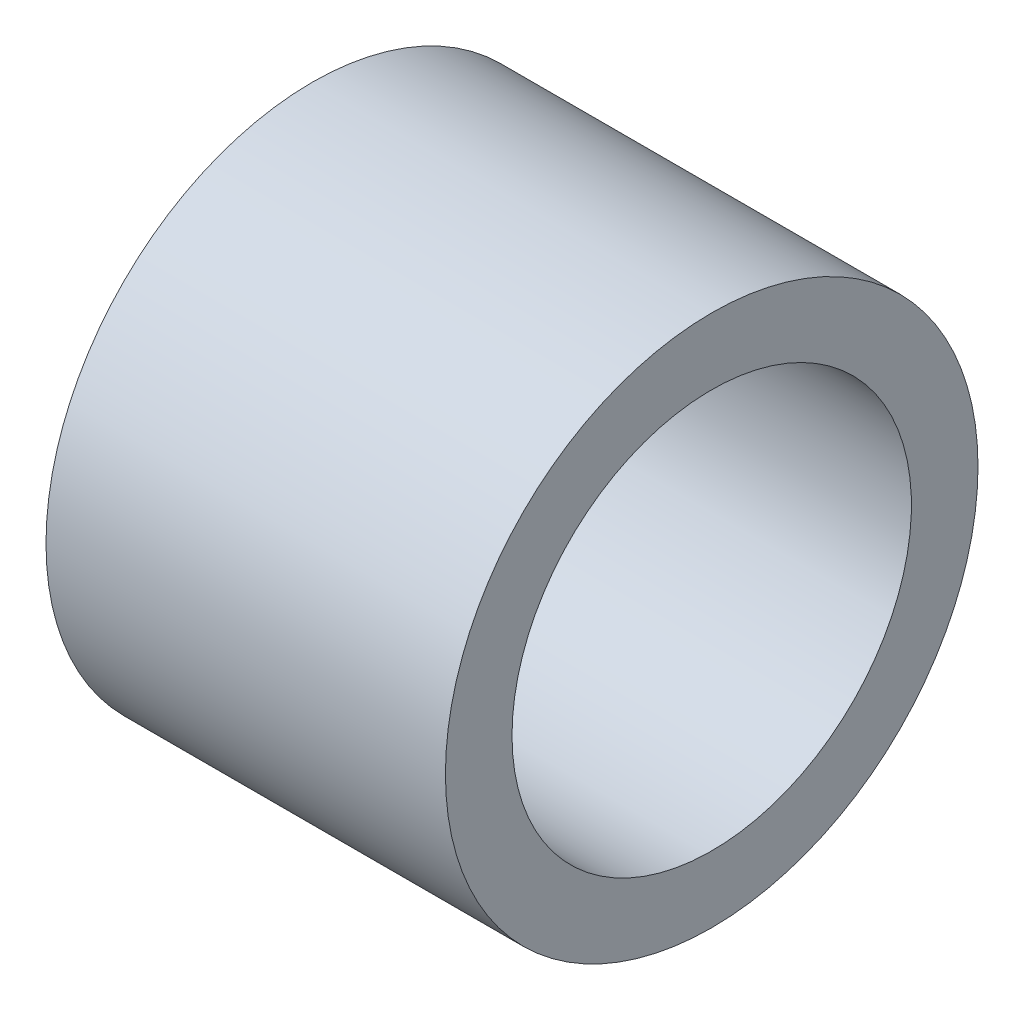
ISO-10303-21;
HEADER;
FILE_DESCRIPTION(('STEP AP214'),'2;1');
FILE_NAME('part.step','',(''),(''),'','','');
FILE_SCHEMA(('AUTOMOTIVE_DESIGN { 1 0 10303 214 1 1 1 1 }'));
ENDSEC;
DATA;
#1=APPLICATION_CONTEXT('core data for automotive mechanical design processes');
#2=APPLICATION_PROTOCOL_DEFINITION('international standard','automotive_design',2000,#1);
#3=PRODUCT_CONTEXT('',#1,'mechanical');
#4=PRODUCT('Part','Part','',(#3));
#5=PRODUCT_RELATED_PRODUCT_CATEGORY('part','',(#4));
#6=PRODUCT_DEFINITION_FORMATION('','',#4);
#7=PRODUCT_DEFINITION_CONTEXT('part definition',#1,'design');
#8=PRODUCT_DEFINITION('design','',#6,#7);
#9=PRODUCT_DEFINITION_SHAPE('','',#8);
#10=(LENGTH_UNIT() NAMED_UNIT(*) SI_UNIT(.MILLI.,.METRE.));
#11=(NAMED_UNIT(*) PLANE_ANGLE_UNIT() SI_UNIT($,.RADIAN.));
#12=(NAMED_UNIT(*) SI_UNIT($,.STERADIAN.) SOLID_ANGLE_UNIT());
#13=UNCERTAINTY_MEASURE_WITH_UNIT(LENGTH_MEASURE(1.E-05),#10,'distance_accuracy_value','');
#14=(GEOMETRIC_REPRESENTATION_CONTEXT(3) GLOBAL_UNCERTAINTY_ASSIGNED_CONTEXT((#13)) GLOBAL_UNIT_ASSIGNED_CONTEXT((#10,
#11,#12)) REPRESENTATION_CONTEXT('',''));
#15=CARTESIAN_POINT('',(0.,0.,0.));
#16=DIRECTION('',(0.,0.,1.));
#17=DIRECTION('',(1.,0.,0.));
#18=AXIS2_PLACEMENT_3D('',#15,#16,#17);
#19=CARTESIAN_POINT('',(0.,3.,0.));
#20=DIRECTION('',(1.,0.,0.));
#21=DIRECTION('',(0.,0.,-1.));
#22=AXIS2_PLACEMENT_3D('',#19,#20,#21);
#23=PLANE('',#22);
#24=CARTESIAN_POINT('',(0.,0.,0.));
#25=DIRECTION('',(-1.,0.,0.));
#26=DIRECTION('',(0.,0.,1.));
#27=AXIS2_PLACEMENT_3D('',#24,#25,#26);
#28=CIRCLE('',#27,3.);
#29=CARTESIAN_POINT('',(0.,0.,3.));
#30=VERTEX_POINT('',#29);
#31=EDGE_CURVE('E59',#30,#30,#28,.T.);
#32=ORIENTED_EDGE('',*,*,#31,.F.);
#33=EDGE_LOOP('',(#32));
#34=FACE_BOUND('',#33,.T.);
#35=CARTESIAN_POINT('',(0.,0.,0.));
#36=DIRECTION('',(-1.,0.,0.));
#37=DIRECTION('',(0.,0.,1.));
#38=AXIS2_PLACEMENT_3D('',#35,#36,#37);
#39=CIRCLE('',#38,4.);
#40=CARTESIAN_POINT('',(0.,0.,4.));
#41=VERTEX_POINT('',#40);
#42=EDGE_CURVE('E10',#41,#41,#39,.T.);
#43=ORIENTED_EDGE('',*,*,#42,.T.);
#44=EDGE_LOOP('',(#43));
#45=FACE_BOUND('',#44,.T.);
#46=ADVANCED_FACE('F40',(#34,#45),#23,.F.);
#47=CARTESIAN_POINT('',(0.,0.,0.));
#48=DIRECTION('',(-1.,0.,0.));
#49=DIRECTION('',(0.,0.,1.));
#50=AXIS2_PLACEMENT_3D('',#47,#48,#49);
#51=CYLINDRICAL_SURFACE('',#50,4.);
#52=ORIENTED_EDGE('',*,*,#42,.F.);
#53=EDGE_LOOP('',(#52));
#54=FACE_BOUND('',#53,.T.);
#55=CARTESIAN_POINT('',(6.,0.,0.));
#56=DIRECTION('',(-1.,0.,0.));
#57=DIRECTION('',(0.,0.,1.));
#58=AXIS2_PLACEMENT_3D('',#55,#56,#57);
#59=CIRCLE('',#58,4.);
#60=CARTESIAN_POINT('',(6.,0.,4.));
#61=VERTEX_POINT('',#60);
#62=EDGE_CURVE('E47',#61,#61,#59,.T.);
#63=ORIENTED_EDGE('',*,*,#62,.T.);
#64=EDGE_LOOP('',(#63));
#65=FACE_BOUND('',#64,.T.);
#66=ADVANCED_FACE('F70',(#54,#65),#51,.T.);
#67=CARTESIAN_POINT('',(6.,3.,0.));
#68=DIRECTION('',(-1.,0.,0.));
#69=DIRECTION('',(0.,0.,1.));
#70=AXIS2_PLACEMENT_3D('',#67,#68,#69);
#71=PLANE('',#70);
#72=ORIENTED_EDGE('',*,*,#62,.F.);
#73=EDGE_LOOP('',(#72));
#74=FACE_BOUND('',#73,.T.);
#75=CARTESIAN_POINT('',(6.,0.,0.));
#76=DIRECTION('',(-1.,0.,0.));
#77=DIRECTION('',(0.,0.,1.));
#78=AXIS2_PLACEMENT_3D('',#75,#76,#77);
#79=CIRCLE('',#78,3.);
#80=CARTESIAN_POINT('',(6.,0.,3.));
#81=VERTEX_POINT('',#80);
#82=EDGE_CURVE('E53',#81,#81,#79,.T.);
#83=ORIENTED_EDGE('',*,*,#82,.T.);
#84=EDGE_LOOP('',(#83));
#85=FACE_BOUND('',#84,.T.);
#86=ADVANCED_FACE('F74',(#74,#85),#71,.F.);
#87=CARTESIAN_POINT('',(0.,0.,0.));
#88=DIRECTION('',(-1.,0.,0.));
#89=DIRECTION('',(0.,0.,1.));
#90=AXIS2_PLACEMENT_3D('',#87,#88,#89);
#91=CYLINDRICAL_SURFACE('',#90,3.);
#92=ORIENTED_EDGE('',*,*,#82,.F.);
#93=EDGE_LOOP('',(#92));
#94=FACE_BOUND('',#93,.T.);
#95=ORIENTED_EDGE('',*,*,#31,.T.);
#96=EDGE_LOOP('',(#95));
#97=FACE_BOUND('',#96,.T.);
#98=ADVANCED_FACE('F67',(#94,#97),#91,.F.);
#99=CLOSED_SHELL('',(#46,#66,#86,#98));
#100=MANIFOLD_SOLID_BREP('B2',#99);
#101=ADVANCED_BREP_SHAPE_REPRESENTATION('',(#18,#100),#14);
#102=SHAPE_DEFINITION_REPRESENTATION(#9,#101);
ENDSEC;
END-ISO-10303-21;
